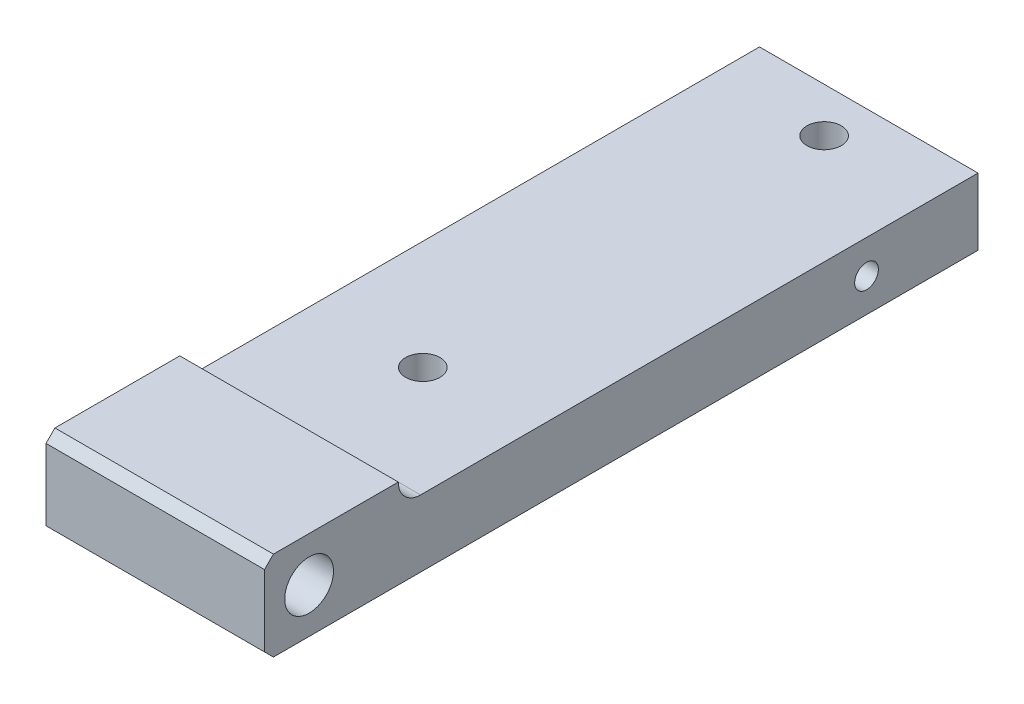
ISO-10303-21;
HEADER;
FILE_DESCRIPTION(('STEP AP214'),'2;1');
FILE_NAME('part.step','',(''),(''),'','','');
FILE_SCHEMA(('AUTOMOTIVE_DESIGN { 1 0 10303 214 1 1 1 1 }'));
ENDSEC;
DATA;
#1=APPLICATION_CONTEXT('core data for automotive mechanical design processes');
#2=APPLICATION_PROTOCOL_DEFINITION('international standard','automotive_design',2000,#1);
#3=PRODUCT_CONTEXT('',#1,'mechanical');
#4=PRODUCT('Part','Part','',(#3));
#5=PRODUCT_RELATED_PRODUCT_CATEGORY('part','',(#4));
#6=PRODUCT_DEFINITION_FORMATION('','',#4);
#7=PRODUCT_DEFINITION_CONTEXT('part definition',#1,'design');
#8=PRODUCT_DEFINITION('design','',#6,#7);
#9=PRODUCT_DEFINITION_SHAPE('','',#8);
#10=(LENGTH_UNIT() NAMED_UNIT(*) SI_UNIT(.MILLI.,.METRE.));
#11=(NAMED_UNIT(*) PLANE_ANGLE_UNIT() SI_UNIT($,.RADIAN.));
#12=(NAMED_UNIT(*) SI_UNIT($,.STERADIAN.) SOLID_ANGLE_UNIT());
#13=UNCERTAINTY_MEASURE_WITH_UNIT(LENGTH_MEASURE(1.E-05),#10,'distance_accuracy_value','');
#14=(GEOMETRIC_REPRESENTATION_CONTEXT(3) GLOBAL_UNCERTAINTY_ASSIGNED_CONTEXT((#13)) GLOBAL_UNIT_ASSIGNED_CONTEXT((#10,
#11,#12)) REPRESENTATION_CONTEXT('',''));
#15=CARTESIAN_POINT('',(0.,0.,0.));
#16=DIRECTION('',(0.,0.,1.));
#17=DIRECTION('',(1.,0.,0.));
#18=AXIS2_PLACEMENT_3D('',#15,#16,#17);
#19=CARTESIAN_POINT('',(31.115,-12.7,203.2));
#20=DIRECTION('',(-1.,0.,0.));
#21=DIRECTION('',(0.,0.,1.));
#22=AXIS2_PLACEMENT_3D('',#19,#20,#21);
#23=PLANE('',#22);
#24=CARTESIAN_POINT('',(31.115,-3.175,31.75));
#25=DIRECTION('',(1.,0.,0.));
#26=DIRECTION('',(0.,0.,-1.));
#27=AXIS2_PLACEMENT_3D('',#24,#25,#26);
#28=CIRCLE('',#27,3.37819999999999);
#29=CARTESIAN_POINT('',(31.115,-3.175,28.3718));
#30=VERTEX_POINT('',#29);
#31=EDGE_CURVE('E133',#30,#30,#28,.T.);
#32=ORIENTED_EDGE('',*,*,#31,.F.);
#33=EDGE_LOOP('',(#32));
#34=FACE_BOUND('',#33,.T.);
#35=CARTESIAN_POINT('',(31.115,0.,190.5));
#36=DIRECTION('',(1.,0.,0.));
#37=DIRECTION('',(0.,0.,-1.));
#38=AXIS2_PLACEMENT_3D('',#35,#36,#37);
#39=CIRCLE('',#38,6.94562999999999);
#40=CARTESIAN_POINT('',(31.115,0.,183.55437));
#41=VERTEX_POINT('',#40);
#42=EDGE_CURVE('E141',#41,#41,#39,.T.);
#43=ORIENTED_EDGE('',*,*,#42,.F.);
#44=EDGE_LOOP('',(#43));
#45=FACE_BOUND('',#44,.T.);
#46=DIRECTION('',(0.,1.,0.));
#47=VECTOR('',#46,1.);
#48=CARTESIAN_POINT('',(31.115,-12.7,203.2));
#49=LINE('',#48,#47);
#50=CARTESIAN_POINT('',(31.115,-10.16,203.2));
#51=VERTEX_POINT('',#50);
#52=CARTESIAN_POINT('',(31.115,10.16,203.2));
#53=VERTEX_POINT('',#52);
#54=EDGE_CURVE('E155',#51,#53,#49,.T.);
#55=ORIENTED_EDGE('',*,*,#54,.F.);
#56=DIRECTION('',(0.,0.707106781186548,0.707106781186548));
#57=VECTOR('',#56,1.);
#58=CARTESIAN_POINT('',(31.115,-10.16,203.2));
#59=LINE('',#58,#57);
#60=CARTESIAN_POINT('',(31.115,-12.7,200.66));
#61=VERTEX_POINT('',#60);
#62=EDGE_CURVE('E187',#51,#61,#59,.F.);
#63=ORIENTED_EDGE('',*,*,#62,.T.);
#64=DIRECTION('',(0.,0.,-1.));
#65=VECTOR('',#64,1.);
#66=CARTESIAN_POINT('',(31.115,-12.7,203.2));
#67=LINE('',#66,#65);
#68=CARTESIAN_POINT('',(31.115,-12.7,0.));
#69=VERTEX_POINT('',#68);
#70=EDGE_CURVE('E162',#61,#69,#67,.T.);
#71=ORIENTED_EDGE('',*,*,#70,.T.);
#72=DIRECTION('',(0.,1.,0.));
#73=VECTOR('',#72,1.);
#74=CARTESIAN_POINT('',(31.115,-12.7,0.));
#75=LINE('',#74,#73);
#76=CARTESIAN_POINT('',(31.115,6.35,0.));
#77=VERTEX_POINT('',#76);
#78=EDGE_CURVE('E154',#69,#77,#75,.T.);
#79=ORIENTED_EDGE('',*,*,#78,.T.);
#80=DIRECTION('',(0.,0.,-1.));
#81=VECTOR('',#80,1.);
#82=CARTESIAN_POINT('',(31.115,6.34999999999999,165.1));
#83=LINE('',#82,#81);
#84=CARTESIAN_POINT('',(31.115,6.34999999999999,158.75));
#85=VERTEX_POINT('',#84);
#86=EDGE_CURVE('E120',#85,#77,#83,.T.);
#87=ORIENTED_EDGE('',*,*,#86,.F.);
#88=CARTESIAN_POINT('',(31.115,12.7,158.75));
#89=DIRECTION('',(-1.,0.,0.));
#90=DIRECTION('',(0.,0.,1.));
#91=AXIS2_PLACEMENT_3D('',#88,#89,#90);
#92=CIRCLE('',#91,6.35);
#93=CARTESIAN_POINT('',(31.115,12.7,165.1));
#94=VERTEX_POINT('',#93);
#95=EDGE_CURVE('E117',#85,#94,#92,.T.);
#96=ORIENTED_EDGE('',*,*,#95,.T.);
#97=DIRECTION('',(0.,0.,-1.));
#98=VECTOR('',#97,1.);
#99=CARTESIAN_POINT('',(31.115,12.7,203.2));
#100=LINE('',#99,#98);
#101=CARTESIAN_POINT('',(31.115,12.7,200.66));
#102=VERTEX_POINT('',#101);
#103=EDGE_CURVE('E104',#102,#94,#100,.T.);
#104=ORIENTED_EDGE('',*,*,#103,.F.);
#105=DIRECTION('',(0.,0.707106781186548,-0.707106781186548));
#106=VECTOR('',#105,1.);
#107=CARTESIAN_POINT('',(31.115,10.16,203.2));
#108=LINE('',#107,#106);
#109=EDGE_CURVE('E185',#102,#53,#108,.F.);
#110=ORIENTED_EDGE('',*,*,#109,.T.);
#111=EDGE_LOOP('',(#55,#63,#71,#79,#87,#96,#104,#110));
#112=FACE_BOUND('',#111,.T.);
#113=ADVANCED_FACE('F39',(#34,#45,#112),#23,.F.);
#114=CARTESIAN_POINT('',(-31.115,12.7,203.2));
#115=DIRECTION('',(0.,-1.,0.));
#116=DIRECTION('',(0.,0.,-1.));
#117=AXIS2_PLACEMENT_3D('',#114,#115,#116);
#118=PLANE('',#117);
#119=DIRECTION('',(0.,0.,-1.));
#120=VECTOR('',#119,1.);
#121=CARTESIAN_POINT('',(-31.115,12.7,203.2));
#122=LINE('',#121,#120);
#123=CARTESIAN_POINT('',(-31.115,12.7,200.66));
#124=VERTEX_POINT('',#123);
#125=CARTESIAN_POINT('',(-31.115,12.7,165.1));
#126=VERTEX_POINT('',#125);
#127=EDGE_CURVE('E114',#124,#126,#122,.T.);
#128=ORIENTED_EDGE('',*,*,#127,.F.);
#129=DIRECTION('',(1.,0.,0.));
#130=VECTOR('',#129,1.);
#131=CARTESIAN_POINT('',(-31.115,12.7,200.66));
#132=LINE('',#131,#130);
#133=EDGE_CURVE('E12',#124,#102,#132,.T.);
#134=ORIENTED_EDGE('',*,*,#133,.T.);
#135=ORIENTED_EDGE('',*,*,#103,.T.);
#136=DIRECTION('',(-1.,0.,0.));
#137=VECTOR('',#136,1.);
#138=CARTESIAN_POINT('',(31.115,12.7,165.1));
#139=LINE('',#138,#137);
#140=EDGE_CURVE('E108',#94,#126,#139,.T.);
#141=ORIENTED_EDGE('',*,*,#140,.T.);
#142=EDGE_LOOP('',(#128,#134,#135,#141));
#143=FACE_BOUND('',#142,.T.);
#144=ADVANCED_FACE('F106',(#143),#118,.F.);
#145=CARTESIAN_POINT('',(-31.115,-12.7,203.2));
#146=DIRECTION('',(1.,0.,0.));
#147=DIRECTION('',(0.,0.,-1.));
#148=AXIS2_PLACEMENT_3D('',#145,#146,#147);
#149=PLANE('',#148);
#150=CARTESIAN_POINT('',(-31.115,-3.175,31.75));
#151=DIRECTION('',(1.,0.,0.));
#152=DIRECTION('',(0.,0.,-1.));
#153=AXIS2_PLACEMENT_3D('',#150,#151,#152);
#154=CIRCLE('',#153,3.37819999999998);
#155=CARTESIAN_POINT('',(-31.115,-3.175,28.3718));
#156=VERTEX_POINT('',#155);
#157=EDGE_CURVE('E128',#156,#156,#154,.T.);
#158=ORIENTED_EDGE('',*,*,#157,.T.);
#159=EDGE_LOOP('',(#158));
#160=FACE_BOUND('',#159,.T.);
#161=CARTESIAN_POINT('',(-31.115,0.,190.5));
#162=DIRECTION('',(1.,0.,0.));
#163=DIRECTION('',(0.,0.,-1.));
#164=AXIS2_PLACEMENT_3D('',#161,#162,#163);
#165=CIRCLE('',#164,6.94562999999999);
#166=CARTESIAN_POINT('',(-31.115,0.,183.55437));
#167=VERTEX_POINT('',#166);
#168=EDGE_CURVE('E145',#167,#167,#165,.T.);
#169=ORIENTED_EDGE('',*,*,#168,.T.);
#170=EDGE_LOOP('',(#169));
#171=FACE_BOUND('',#170,.T.);
#172=DIRECTION('',(0.,0.,-1.));
#173=VECTOR('',#172,1.);
#174=CARTESIAN_POINT('',(-31.115,-12.7,203.2));
#175=LINE('',#174,#173);
#176=CARTESIAN_POINT('',(-31.115,-12.7,200.66));
#177=VERTEX_POINT('',#176);
#178=CARTESIAN_POINT('',(-31.115,-12.7,0.));
#179=VERTEX_POINT('',#178);
#180=EDGE_CURVE('E171',#177,#179,#175,.T.);
#181=ORIENTED_EDGE('',*,*,#180,.F.);
#182=DIRECTION('',(0.,-0.707106781186548,-0.707106781186548));
#183=VECTOR('',#182,1.);
#184=CARTESIAN_POINT('',(-31.115,-10.16,203.2));
#185=LINE('',#184,#183);
#186=CARTESIAN_POINT('',(-31.115,-10.16,203.2));
#187=VERTEX_POINT('',#186);
#188=EDGE_CURVE('E47',#177,#187,#185,.F.);
#189=ORIENTED_EDGE('',*,*,#188,.T.);
#190=DIRECTION('',(0.,-1.,0.));
#191=VECTOR('',#190,1.);
#192=CARTESIAN_POINT('',(-31.115,-12.7,203.2));
#193=LINE('',#192,#191);
#194=CARTESIAN_POINT('',(-31.115,10.16,203.2));
#195=VERTEX_POINT('',#194);
#196=EDGE_CURVE('E158',#195,#187,#193,.T.);
#197=ORIENTED_EDGE('',*,*,#196,.F.);
#198=DIRECTION('',(0.,-0.707106781186548,0.707106781186548));
#199=VECTOR('',#198,1.);
#200=CARTESIAN_POINT('',(-31.115,10.16,203.2));
#201=LINE('',#200,#199);
#202=EDGE_CURVE('E54',#195,#124,#201,.F.);
#203=ORIENTED_EDGE('',*,*,#202,.T.);
#204=ORIENTED_EDGE('',*,*,#127,.T.);
#205=CARTESIAN_POINT('',(-31.115,12.7,158.75));
#206=DIRECTION('',(1.,0.,0.));
#207=DIRECTION('',(0.,0.,-1.));
#208=AXIS2_PLACEMENT_3D('',#205,#206,#207);
#209=CIRCLE('',#208,6.35);
#210=CARTESIAN_POINT('',(-31.115,6.34999999999999,158.75));
#211=VERTEX_POINT('',#210);
#212=EDGE_CURVE('E124',#126,#211,#209,.T.);
#213=ORIENTED_EDGE('',*,*,#212,.T.);
#214=DIRECTION('',(0.,0.,1.));
#215=VECTOR('',#214,1.);
#216=CARTESIAN_POINT('',(-31.115,6.34999999999999,165.1));
#217=LINE('',#216,#215);
#218=CARTESIAN_POINT('',(-31.115,6.34999999999999,0.));
#219=VERTEX_POINT('',#218);
#220=EDGE_CURVE('E130',#219,#211,#217,.T.);
#221=ORIENTED_EDGE('',*,*,#220,.F.);
#222=DIRECTION('',(0.,-1.,0.));
#223=VECTOR('',#222,1.);
#224=CARTESIAN_POINT('',(-31.115,-12.7,0.));
#225=LINE('',#224,#223);
#226=EDGE_CURVE('E164',#219,#179,#225,.T.);
#227=ORIENTED_EDGE('',*,*,#226,.T.);
#228=EDGE_LOOP('',(#181,#189,#197,#203,#204,#213,#221,#227));
#229=FACE_BOUND('',#228,.T.);
#230=ADVANCED_FACE('F191',(#160,#171,#229),#149,.F.);
#231=CARTESIAN_POINT('',(0.,0.,0.));
#232=DIRECTION('',(0.,0.,-1.));
#233=DIRECTION('',(-1.,0.,0.));
#234=AXIS2_PLACEMENT_3D('',#231,#232,#233);
#235=PLANE('',#234);
#236=ORIENTED_EDGE('',*,*,#226,.F.);
#237=DIRECTION('',(-1.,0.,0.));
#238=VECTOR('',#237,1.);
#239=CARTESIAN_POINT('',(31.115,6.34999999999999,0.));
#240=LINE('',#239,#238);
#241=EDGE_CURVE('E127',#77,#219,#240,.T.);
#242=ORIENTED_EDGE('',*,*,#241,.F.);
#243=ORIENTED_EDGE('',*,*,#78,.F.);
#244=DIRECTION('',(1.,0.,0.));
#245=VECTOR('',#244,1.);
#246=CARTESIAN_POINT('',(-31.115,-12.7,0.));
#247=LINE('',#246,#245);
#248=EDGE_CURVE('E159',#179,#69,#247,.T.);
#249=ORIENTED_EDGE('',*,*,#248,.F.);
#250=EDGE_LOOP('',(#236,#242,#243,#249));
#251=FACE_BOUND('',#250,.T.);
#252=ADVANCED_FACE('F204',(#251),#235,.T.);
#253=CARTESIAN_POINT('',(0.,12.7,127.));
#254=DIRECTION('',(0.,1.,0.));
#255=DIRECTION('',(0.,0.,1.));
#256=AXIS2_PLACEMENT_3D('',#253,#254,#255);
#257=CYLINDRICAL_SURFACE('',#256,4.90219999999999);
#258=CARTESIAN_POINT('',(0.,-12.7,127.));
#259=DIRECTION('',(0.,1.,0.));
#260=DIRECTION('',(0.,0.,1.));
#261=AXIS2_PLACEMENT_3D('',#258,#259,#260);
#262=CIRCLE('',#261,4.90219999999999);
#263=CARTESIAN_POINT('',(0.,-12.7,131.9022));
#264=VERTEX_POINT('',#263);
#265=EDGE_CURVE('E151',#264,#264,#262,.T.);
#266=ORIENTED_EDGE('',*,*,#265,.F.);
#267=EDGE_LOOP('',(#266));
#268=FACE_BOUND('',#267,.T.);
#269=CARTESIAN_POINT('',(0.,6.35,127.));
#270=DIRECTION('',(0.,1.,0.));
#271=DIRECTION('',(0.,0.,1.));
#272=AXIS2_PLACEMENT_3D('',#269,#270,#271);
#273=CIRCLE('',#272,4.90219999999999);
#274=CARTESIAN_POINT('',(0.,6.35,131.9022));
#275=VERTEX_POINT('',#274);
#276=EDGE_CURVE('E138',#275,#275,#273,.F.);
#277=ORIENTED_EDGE('',*,*,#276,.F.);
#278=EDGE_LOOP('',(#277));
#279=FACE_BOUND('',#278,.T.);
#280=ADVANCED_FACE('F238',(#268,#279),#257,.F.);
#281=CARTESIAN_POINT('',(0.,12.7,12.7));
#282=DIRECTION('',(0.,1.,0.));
#283=DIRECTION('',(0.,0.,1.));
#284=AXIS2_PLACEMENT_3D('',#281,#282,#283);
#285=CYLINDRICAL_SURFACE('',#284,4.90219999999999);
#286=CARTESIAN_POINT('',(0.,-12.7,12.7));
#287=DIRECTION('',(0.,1.,0.));
#288=DIRECTION('',(0.,0.,1.));
#289=AXIS2_PLACEMENT_3D('',#286,#287,#288);
#290=CIRCLE('',#289,4.90219999999999);
#291=CARTESIAN_POINT('',(0.,-12.7,17.6022));
#292=VERTEX_POINT('',#291);
#293=EDGE_CURVE('E148',#292,#292,#290,.T.);
#294=ORIENTED_EDGE('',*,*,#293,.F.);
#295=EDGE_LOOP('',(#294));
#296=FACE_BOUND('',#295,.T.);
#297=CARTESIAN_POINT('',(0.,6.35,12.7));
#298=DIRECTION('',(0.,1.,0.));
#299=DIRECTION('',(0.,0.,1.));
#300=AXIS2_PLACEMENT_3D('',#297,#298,#299);
#301=CIRCLE('',#300,4.90219999999999);
#302=CARTESIAN_POINT('',(0.,6.35,17.6022));
#303=VERTEX_POINT('',#302);
#304=EDGE_CURVE('E142',#303,#303,#301,.F.);
#305=ORIENTED_EDGE('',*,*,#304,.F.);
#306=EDGE_LOOP('',(#305));
#307=FACE_BOUND('',#306,.T.);
#308=ADVANCED_FACE('F235',(#296,#307),#285,.F.);
#309=CARTESIAN_POINT('',(-31.115,-12.7,203.2));
#310=DIRECTION('',(0.,1.,0.));
#311=DIRECTION('',(0.,0.,1.));
#312=AXIS2_PLACEMENT_3D('',#309,#310,#311);
#313=PLANE('',#312);
#314=ORIENTED_EDGE('',*,*,#293,.T.);
#315=EDGE_LOOP('',(#314));
#316=FACE_BOUND('',#315,.T.);
#317=ORIENTED_EDGE('',*,*,#265,.T.);
#318=EDGE_LOOP('',(#317));
#319=FACE_BOUND('',#318,.T.);
#320=ORIENTED_EDGE('',*,*,#70,.F.);
#321=DIRECTION('',(-1.,0.,0.));
#322=VECTOR('',#321,1.);
#323=CARTESIAN_POINT('',(-31.115,-12.7,200.66));
#324=LINE('',#323,#322);
#325=EDGE_CURVE('E62',#61,#177,#324,.T.);
#326=ORIENTED_EDGE('',*,*,#325,.T.);
#327=ORIENTED_EDGE('',*,*,#180,.T.);
#328=ORIENTED_EDGE('',*,*,#248,.T.);
#329=EDGE_LOOP('',(#320,#326,#327,#328));
#330=FACE_BOUND('',#329,.T.);
#331=ADVANCED_FACE('F198',(#316,#319,#330),#313,.F.);
#332=CARTESIAN_POINT('',(0.,0.,203.2));
#333=DIRECTION('',(0.,0.,-1.));
#334=DIRECTION('',(-1.,0.,0.));
#335=AXIS2_PLACEMENT_3D('',#332,#333,#334);
#336=PLANE('',#335);
#337=ORIENTED_EDGE('',*,*,#196,.T.);
#338=DIRECTION('',(1.,0.,0.));
#339=VECTOR('',#338,1.);
#340=CARTESIAN_POINT('',(0.,-10.16,203.2));
#341=LINE('',#340,#339);
#342=EDGE_CURVE('E182',#187,#51,#341,.T.);
#343=ORIENTED_EDGE('',*,*,#342,.T.);
#344=ORIENTED_EDGE('',*,*,#54,.T.);
#345=DIRECTION('',(-1.,0.,0.));
#346=VECTOR('',#345,1.);
#347=CARTESIAN_POINT('',(0.,10.16,203.2));
#348=LINE('',#347,#346);
#349=EDGE_CURVE('E179',#53,#195,#348,.T.);
#350=ORIENTED_EDGE('',*,*,#349,.T.);
#351=EDGE_LOOP('',(#337,#343,#344,#350));
#352=FACE_BOUND('',#351,.T.);
#353=ADVANCED_FACE('F195',(#352),#336,.F.);
#354=CARTESIAN_POINT('',(31.115,0.,190.5));
#355=DIRECTION('',(1.,0.,0.));
#356=DIRECTION('',(0.,0.,-1.));
#357=AXIS2_PLACEMENT_3D('',#354,#355,#356);
#358=CYLINDRICAL_SURFACE('',#357,6.94562999999999);
#359=ORIENTED_EDGE('',*,*,#168,.F.);
#360=EDGE_LOOP('',(#359));
#361=FACE_BOUND('',#360,.T.);
#362=ORIENTED_EDGE('',*,*,#42,.T.);
#363=EDGE_LOOP('',(#362));
#364=FACE_BOUND('',#363,.T.);
#365=ADVANCED_FACE('F221',(#361,#364),#358,.F.);
#366=CARTESIAN_POINT('',(-31.115,6.35,203.2));
#367=DIRECTION('',(0.,1.,0.));
#368=DIRECTION('',(0.,0.,1.));
#369=AXIS2_PLACEMENT_3D('',#366,#367,#368);
#370=PLANE('',#369);
#371=ORIENTED_EDGE('',*,*,#304,.T.);
#372=EDGE_LOOP('',(#371));
#373=FACE_BOUND('',#372,.T.);
#374=ORIENTED_EDGE('',*,*,#220,.T.);
#375=DIRECTION('',(1.,0.,0.));
#376=VECTOR('',#375,1.);
#377=CARTESIAN_POINT('',(31.115,6.35,158.75));
#378=LINE('',#377,#376);
#379=EDGE_CURVE('E113',#211,#85,#378,.T.);
#380=ORIENTED_EDGE('',*,*,#379,.T.);
#381=ORIENTED_EDGE('',*,*,#86,.T.);
#382=ORIENTED_EDGE('',*,*,#241,.T.);
#383=EDGE_LOOP('',(#374,#380,#381,#382));
#384=FACE_BOUND('',#383,.T.);
#385=ORIENTED_EDGE('',*,*,#276,.T.);
#386=EDGE_LOOP('',(#385));
#387=FACE_BOUND('',#386,.T.);
#388=ADVANCED_FACE('F208',(#373,#384,#387),#370,.T.);
#389=CARTESIAN_POINT('',(-31.115,12.7,158.75));
#390=DIRECTION('',(-1.,0.,0.));
#391=DIRECTION('',(0.,0.,1.));
#392=AXIS2_PLACEMENT_3D('',#389,#390,#391);
#393=CYLINDRICAL_SURFACE('',#392,6.35);
#394=ORIENTED_EDGE('',*,*,#212,.F.);
#395=ORIENTED_EDGE('',*,*,#140,.F.);
#396=ORIENTED_EDGE('',*,*,#95,.F.);
#397=ORIENTED_EDGE('',*,*,#379,.F.);
#398=EDGE_LOOP('',(#394,#395,#396,#397));
#399=FACE_BOUND('',#398,.T.);
#400=ADVANCED_FACE('F126',(#399),#393,.F.);
#401=CARTESIAN_POINT('',(0.,-10.16,203.2));
#402=DIRECTION('',(0.,0.707106781186548,-0.707106781186548));
#403=DIRECTION('',(1.,0.,0.));
#404=AXIS2_PLACEMENT_3D('',#401,#402,#403);
#405=PLANE('',#404);
#406=ORIENTED_EDGE('',*,*,#188,.F.);
#407=ORIENTED_EDGE('',*,*,#325,.F.);
#408=ORIENTED_EDGE('',*,*,#62,.F.);
#409=ORIENTED_EDGE('',*,*,#342,.F.);
#410=EDGE_LOOP('',(#406,#407,#408,#409));
#411=FACE_BOUND('',#410,.T.);
#412=ADVANCED_FACE('F197',(#411),#405,.F.);
#413=CARTESIAN_POINT('',(0.,10.16,203.2));
#414=DIRECTION('',(0.,-0.707106781186548,-0.707106781186548));
#415=DIRECTION('',(-1.,0.,0.));
#416=AXIS2_PLACEMENT_3D('',#413,#414,#415);
#417=PLANE('',#416);
#418=ORIENTED_EDGE('',*,*,#109,.F.);
#419=ORIENTED_EDGE('',*,*,#133,.F.);
#420=ORIENTED_EDGE('',*,*,#202,.F.);
#421=ORIENTED_EDGE('',*,*,#349,.F.);
#422=EDGE_LOOP('',(#418,#419,#420,#421));
#423=FACE_BOUND('',#422,.T.);
#424=ADVANCED_FACE('F41',(#423),#417,.F.);
#425=CARTESIAN_POINT('',(31.115,-3.175,31.75));
#426=DIRECTION('',(1.,0.,0.));
#427=DIRECTION('',(0.,0.,-1.));
#428=AXIS2_PLACEMENT_3D('',#425,#426,#427);
#429=CYLINDRICAL_SURFACE('',#428,3.37819999999999);
#430=ORIENTED_EDGE('',*,*,#157,.F.);
#431=EDGE_LOOP('',(#430));
#432=FACE_BOUND('',#431,.T.);
#433=ORIENTED_EDGE('',*,*,#31,.T.);
#434=EDGE_LOOP('',(#433));
#435=FACE_BOUND('',#434,.T.);
#436=ADVANCED_FACE('F214',(#432,#435),#429,.F.);
#437=CLOSED_SHELL('',(#113,#144,#230,#252,#280,#308,#331,#353,#365,#388,#400,#412,#424,#436));
#438=MANIFOLD_SOLID_BREP('B2',#437);
#439=ADVANCED_BREP_SHAPE_REPRESENTATION('',(#18,#438),#14);
#440=SHAPE_DEFINITION_REPRESENTATION(#9,#439);
ENDSEC;
END-ISO-10303-21;
